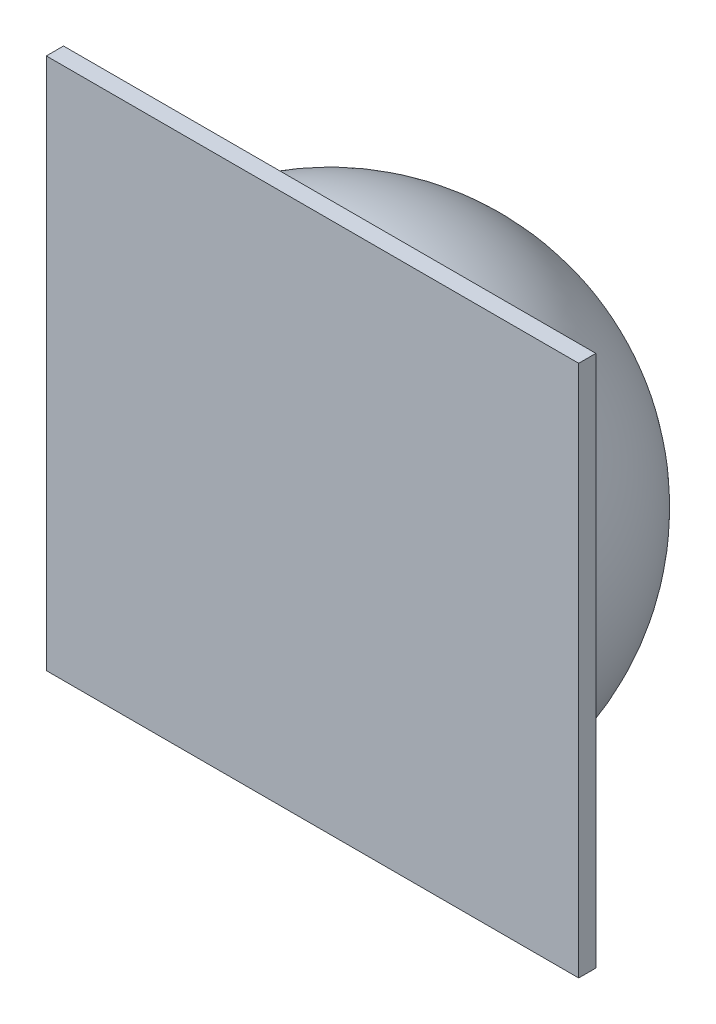
ISO-10303-21;
HEADER;
FILE_DESCRIPTION(('STEP AP214'),'2;1');
FILE_NAME('part.step','',(''),(''),'','','');
FILE_SCHEMA(('AUTOMOTIVE_DESIGN { 1 0 10303 214 1 1 1 1 }'));
ENDSEC;
DATA;
#1=APPLICATION_CONTEXT('core data for automotive mechanical design processes');
#2=APPLICATION_PROTOCOL_DEFINITION('international standard','automotive_design',2000,#1);
#3=PRODUCT_CONTEXT('',#1,'mechanical');
#4=PRODUCT('Part','Part','',(#3));
#5=PRODUCT_RELATED_PRODUCT_CATEGORY('part','',(#4));
#6=PRODUCT_DEFINITION_FORMATION('','',#4);
#7=PRODUCT_DEFINITION_CONTEXT('part definition',#1,'design');
#8=PRODUCT_DEFINITION('design','',#6,#7);
#9=PRODUCT_DEFINITION_SHAPE('','',#8);
#10=(LENGTH_UNIT() NAMED_UNIT(*) SI_UNIT(.MILLI.,.METRE.));
#11=(NAMED_UNIT(*) PLANE_ANGLE_UNIT() SI_UNIT($,.RADIAN.));
#12=(NAMED_UNIT(*) SI_UNIT($,.STERADIAN.) SOLID_ANGLE_UNIT());
#13=UNCERTAINTY_MEASURE_WITH_UNIT(LENGTH_MEASURE(1.E-05),#10,'distance_accuracy_value','');
#14=(GEOMETRIC_REPRESENTATION_CONTEXT(3) GLOBAL_UNCERTAINTY_ASSIGNED_CONTEXT((#13)) GLOBAL_UNIT_ASSIGNED_CONTEXT((#10,
#11,#12)) REPRESENTATION_CONTEXT('',''));
#15=CARTESIAN_POINT('',(0.,0.,0.));
#16=DIRECTION('',(0.,0.,1.));
#17=DIRECTION('',(1.,0.,0.));
#18=AXIS2_PLACEMENT_3D('',#15,#16,#17);
#19=CARTESIAN_POINT('',(0.,0.,0.));
#20=DIRECTION('',(0.,0.,-1.));
#21=DIRECTION('',(1.,0.,0.));
#22=AXIS2_PLACEMENT_3D('',#19,#20,#21);
#23=SPHERICAL_SURFACE('',#22,14.);
#24=CARTESIAN_POINT('',(0.,0.,0.));
#25=DIRECTION('',(0.,0.,-1.));
#26=DIRECTION('',(-1.,0.,0.));
#27=AXIS2_PLACEMENT_3D('',#24,#25,#26);
#28=CIRCLE('',#27,14.);
#29=CARTESIAN_POINT('',(-14.,0.,0.));
#30=VERTEX_POINT('',#29);
#31=EDGE_CURVE('E42',#30,#30,#28,.T.);
#32=ORIENTED_EDGE('',*,*,#31,.T.);
#33=EDGE_LOOP('',(#32));
#34=FACE_BOUND('',#33,.T.);
#35=ADVANCED_FACE('F33',(#34),#23,.T.);
#36=CARTESIAN_POINT('',(-15.5,15.5,1.));
#37=DIRECTION('',(1.,0.,0.));
#38=DIRECTION('',(0.,1.,0.));
#39=AXIS2_PLACEMENT_3D('',#36,#37,#38);
#40=PLANE('',#39);
#41=DIRECTION('',(0.,-1.,0.));
#42=VECTOR('',#41,1.);
#43=CARTESIAN_POINT('',(-15.5,15.5,0.));
#44=LINE('',#43,#42);
#45=CARTESIAN_POINT('',(-15.5,15.5,0.));
#46=VERTEX_POINT('',#45);
#47=CARTESIAN_POINT('',(-15.5,-15.5,0.));
#48=VERTEX_POINT('',#47);
#49=EDGE_CURVE('E101',#46,#48,#44,.T.);
#50=ORIENTED_EDGE('',*,*,#49,.T.);
#51=DIRECTION('',(0.,0.,-1.));
#52=VECTOR('',#51,1.);
#53=CARTESIAN_POINT('',(-15.5,-15.5,1.));
#54=LINE('',#53,#52);
#55=CARTESIAN_POINT('',(-15.5,-15.5,1.));
#56=VERTEX_POINT('',#55);
#57=EDGE_CURVE('E92',#56,#48,#54,.T.);
#58=ORIENTED_EDGE('',*,*,#57,.F.);
#59=DIRECTION('',(0.,-1.,0.));
#60=VECTOR('',#59,1.);
#61=CARTESIAN_POINT('',(-15.5,15.5,1.));
#62=LINE('',#61,#60);
#63=CARTESIAN_POINT('',(-15.5,15.5,1.));
#64=VERTEX_POINT('',#63);
#65=EDGE_CURVE('E86',#64,#56,#62,.T.);
#66=ORIENTED_EDGE('',*,*,#65,.F.);
#67=DIRECTION('',(0.,0.,-1.));
#68=VECTOR('',#67,1.);
#69=CARTESIAN_POINT('',(-15.5,15.5,1.));
#70=LINE('',#69,#68);
#71=EDGE_CURVE('E97',#64,#46,#70,.T.);
#72=ORIENTED_EDGE('',*,*,#71,.T.);
#73=EDGE_LOOP('',(#50,#58,#66,#72));
#74=FACE_BOUND('',#73,.T.);
#75=ADVANCED_FACE('F120',(#74),#40,.F.);
#76=CARTESIAN_POINT('',(15.5,-15.5,1.));
#77=DIRECTION('',(0.,1.,0.));
#78=DIRECTION('',(-1.,0.,0.));
#79=AXIS2_PLACEMENT_3D('',#76,#77,#78);
#80=PLANE('',#79);
#81=DIRECTION('',(1.,0.,0.));
#82=VECTOR('',#81,1.);
#83=CARTESIAN_POINT('',(15.5,-15.5,0.));
#84=LINE('',#83,#82);
#85=CARTESIAN_POINT('',(15.5,-15.5,0.));
#86=VERTEX_POINT('',#85);
#87=EDGE_CURVE('E91',#48,#86,#84,.T.);
#88=ORIENTED_EDGE('',*,*,#87,.T.);
#89=DIRECTION('',(0.,0.,-1.));
#90=VECTOR('',#89,1.);
#91=CARTESIAN_POINT('',(15.5,-15.5,1.));
#92=LINE('',#91,#90);
#93=CARTESIAN_POINT('',(15.5,-15.5,1.));
#94=VERTEX_POINT('',#93);
#95=EDGE_CURVE('E89',#94,#86,#92,.T.);
#96=ORIENTED_EDGE('',*,*,#95,.F.);
#97=DIRECTION('',(1.,0.,0.));
#98=VECTOR('',#97,1.);
#99=CARTESIAN_POINT('',(15.5,-15.5,1.));
#100=LINE('',#99,#98);
#101=EDGE_CURVE('E81',#56,#94,#100,.T.);
#102=ORIENTED_EDGE('',*,*,#101,.F.);
#103=ORIENTED_EDGE('',*,*,#57,.T.);
#104=EDGE_LOOP('',(#88,#96,#102,#103));
#105=FACE_BOUND('',#104,.T.);
#106=ADVANCED_FACE('F90',(#105),#80,.F.);
#107=CARTESIAN_POINT('',(15.5,15.5,1.));
#108=DIRECTION('',(-1.,0.,0.));
#109=DIRECTION('',(0.,-1.,0.));
#110=AXIS2_PLACEMENT_3D('',#107,#108,#109);
#111=PLANE('',#110);
#112=DIRECTION('',(0.,1.,0.));
#113=VECTOR('',#112,1.);
#114=CARTESIAN_POINT('',(15.5,15.5,0.));
#115=LINE('',#114,#113);
#116=CARTESIAN_POINT('',(15.5,15.5,0.));
#117=VERTEX_POINT('',#116);
#118=EDGE_CURVE('E67',#86,#117,#115,.T.);
#119=ORIENTED_EDGE('',*,*,#118,.T.);
#120=DIRECTION('',(0.,0.,-1.));
#121=VECTOR('',#120,1.);
#122=CARTESIAN_POINT('',(15.5,15.5,1.));
#123=LINE('',#122,#121);
#124=CARTESIAN_POINT('',(15.5,15.5,1.));
#125=VERTEX_POINT('',#124);
#126=EDGE_CURVE('E93',#125,#117,#123,.T.);
#127=ORIENTED_EDGE('',*,*,#126,.F.);
#128=DIRECTION('',(0.,1.,0.));
#129=VECTOR('',#128,1.);
#130=CARTESIAN_POINT('',(15.5,15.5,1.));
#131=LINE('',#130,#129);
#132=EDGE_CURVE('E84',#94,#125,#131,.T.);
#133=ORIENTED_EDGE('',*,*,#132,.F.);
#134=ORIENTED_EDGE('',*,*,#95,.T.);
#135=EDGE_LOOP('',(#119,#127,#133,#134));
#136=FACE_BOUND('',#135,.T.);
#137=ADVANCED_FACE('F95',(#136),#111,.F.);
#138=CARTESIAN_POINT('',(15.5,15.5,1.));
#139=DIRECTION('',(0.,-1.,0.));
#140=DIRECTION('',(1.,0.,0.));
#141=AXIS2_PLACEMENT_3D('',#138,#139,#140);
#142=PLANE('',#141);
#143=DIRECTION('',(-1.,0.,0.));
#144=VECTOR('',#143,1.);
#145=CARTESIAN_POINT('',(15.5,15.5,0.));
#146=LINE('',#145,#144);
#147=EDGE_CURVE('E73',#117,#46,#146,.T.);
#148=ORIENTED_EDGE('',*,*,#147,.T.);
#149=ORIENTED_EDGE('',*,*,#71,.F.);
#150=DIRECTION('',(-1.,0.,0.));
#151=VECTOR('',#150,1.);
#152=CARTESIAN_POINT('',(15.5,15.5,1.));
#153=LINE('',#152,#151);
#154=EDGE_CURVE('E50',#125,#64,#153,.T.);
#155=ORIENTED_EDGE('',*,*,#154,.F.);
#156=ORIENTED_EDGE('',*,*,#126,.T.);
#157=EDGE_LOOP('',(#148,#149,#155,#156));
#158=FACE_BOUND('',#157,.T.);
#159=ADVANCED_FACE('F121',(#158),#142,.F.);
#160=CARTESIAN_POINT('',(0.,0.,1.));
#161=DIRECTION('',(0.,0.,-1.));
#162=DIRECTION('',(-1.,0.,0.));
#163=AXIS2_PLACEMENT_3D('',#160,#161,#162);
#164=PLANE('',#163);
#165=ORIENTED_EDGE('',*,*,#65,.T.);
#166=ORIENTED_EDGE('',*,*,#101,.T.);
#167=ORIENTED_EDGE('',*,*,#132,.T.);
#168=ORIENTED_EDGE('',*,*,#154,.T.);
#169=EDGE_LOOP('',(#165,#166,#167,#168));
#170=FACE_BOUND('',#169,.T.);
#171=ADVANCED_FACE('F82',(#170),#164,.F.);
#172=CARTESIAN_POINT('',(0.,0.,0.));
#173=DIRECTION('',(0.,0.,-1.));
#174=DIRECTION('',(-1.,0.,0.));
#175=AXIS2_PLACEMENT_3D('',#172,#173,#174);
#176=PLANE('',#175);
#177=ORIENTED_EDGE('',*,*,#31,.F.);
#178=EDGE_LOOP('',(#177));
#179=FACE_BOUND('',#178,.T.);
#180=ORIENTED_EDGE('',*,*,#49,.F.);
#181=ORIENTED_EDGE('',*,*,#147,.F.);
#182=ORIENTED_EDGE('',*,*,#118,.F.);
#183=ORIENTED_EDGE('',*,*,#87,.F.);
#184=EDGE_LOOP('',(#180,#181,#182,#183));
#185=FACE_BOUND('',#184,.T.);
#186=ADVANCED_FACE('F113',(#179,#185),#176,.T.);
#187=CLOSED_SHELL('',(#35,#75,#106,#137,#159,#171,#186));
#188=CARTESIAN_POINT('',(0.,0.,0.));
#189=DIRECTION('',(0.,0.,-1.));
#190=DIRECTION('',(-1.,0.,0.));
#191=AXIS2_PLACEMENT_3D('',#188,#189,#190);
#192=CIRCLE('',#191,12.);
#193=CARTESIAN_POINT('',(-12.,0.,0.));
#194=VERTEX_POINT('',#193);
#195=EDGE_CURVE('E11',#194,#194,#192,.T.);
#196=ORIENTED_EDGE('',*,*,#195,.T.);
#197=EDGE_LOOP('',(#196));
#198=FACE_BOUND('',#197,.T.);
#199=ADVANCED_FACE('F117',(#198),#176,.T.);
#200=CARTESIAN_POINT('',(0.,0.,0.));
#201=DIRECTION('',(0.,0.,-1.));
#202=DIRECTION('',(1.,0.,0.));
#203=AXIS2_PLACEMENT_3D('',#200,#201,#202);
#204=SPHERICAL_SURFACE('',#203,12.);
#205=ORIENTED_EDGE('',*,*,#195,.F.);
#206=EDGE_LOOP('',(#205));
#207=FACE_BOUND('',#206,.T.);
#208=ADVANCED_FACE('F139',(#207),#204,.F.);
#209=CLOSED_SHELL('',(#199,#208));
#210=ORIENTED_CLOSED_SHELL('',*,#209,.T.);
#211=BREP_WITH_VOIDS('B2',#187,(#210));
#212=ADVANCED_BREP_SHAPE_REPRESENTATION('',(#18,#211),#14);
#213=SHAPE_DEFINITION_REPRESENTATION(#9,#212);
ENDSEC;
END-ISO-10303-21;
